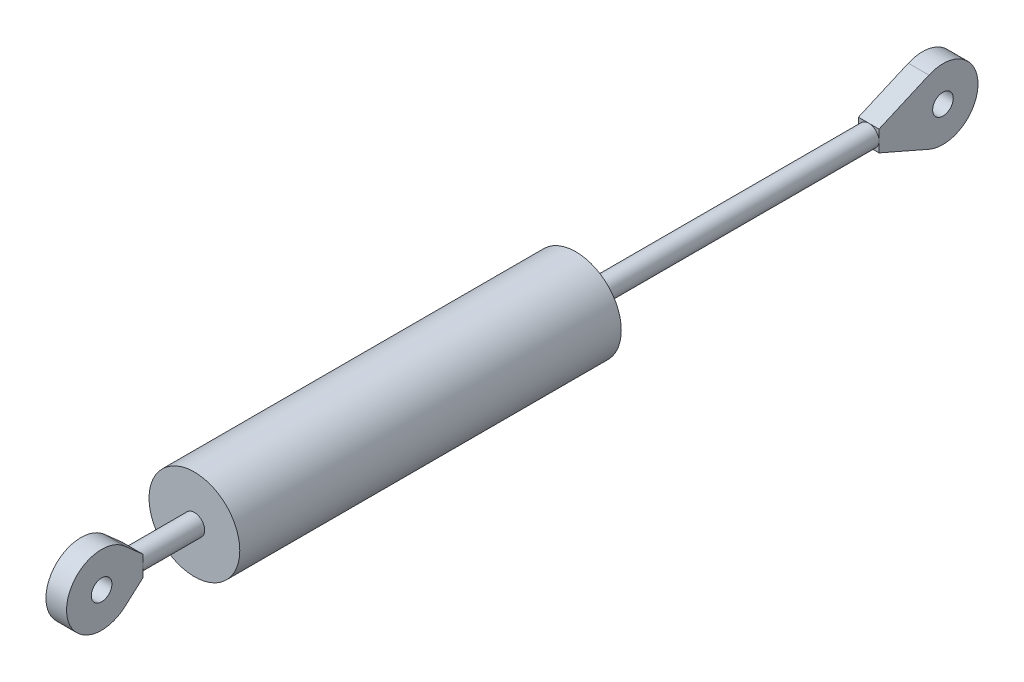
ISO-10303-21;
HEADER;
FILE_DESCRIPTION(('STEP AP214'),'2;1');
FILE_NAME('part.step','',(''),(''),'','','');
FILE_SCHEMA(('AUTOMOTIVE_DESIGN { 1 0 10303 214 1 1 1 1 }'));
ENDSEC;
DATA;
#1=APPLICATION_CONTEXT('core data for automotive mechanical design processes');
#2=APPLICATION_PROTOCOL_DEFINITION('international standard','automotive_design',2000,#1);
#3=PRODUCT_CONTEXT('',#1,'mechanical');
#4=PRODUCT('Part','Part','',(#3));
#5=PRODUCT_RELATED_PRODUCT_CATEGORY('part','',(#4));
#6=PRODUCT_DEFINITION_FORMATION('','',#4);
#7=PRODUCT_DEFINITION_CONTEXT('part definition',#1,'design');
#8=PRODUCT_DEFINITION('design','',#6,#7);
#9=PRODUCT_DEFINITION_SHAPE('','',#8);
#10=(LENGTH_UNIT() NAMED_UNIT(*) SI_UNIT(.MILLI.,.METRE.));
#11=(NAMED_UNIT(*) PLANE_ANGLE_UNIT() SI_UNIT($,.RADIAN.));
#12=(NAMED_UNIT(*) SI_UNIT($,.STERADIAN.) SOLID_ANGLE_UNIT());
#13=UNCERTAINTY_MEASURE_WITH_UNIT(LENGTH_MEASURE(1.E-05),#10,'distance_accuracy_value','');
#14=(GEOMETRIC_REPRESENTATION_CONTEXT(3) GLOBAL_UNCERTAINTY_ASSIGNED_CONTEXT((#13)) GLOBAL_UNIT_ASSIGNED_CONTEXT((#10,
#11,#12)) REPRESENTATION_CONTEXT('',''));
#15=CARTESIAN_POINT('',(0.,0.,0.));
#16=DIRECTION('',(0.,0.,1.));
#17=DIRECTION('',(1.,0.,0.));
#18=AXIS2_PLACEMENT_3D('',#15,#16,#17);
#19=CARTESIAN_POINT('',(0.,11.,46.25));
#20=DIRECTION('',(0.,0.,-1.));
#21=DIRECTION('',(-1.,0.,0.));
#22=AXIS2_PLACEMENT_3D('',#19,#20,#21);
#23=PLANE('',#22);
#24=CARTESIAN_POINT('',(0.,0.,46.25));
#25=DIRECTION('',(0.,0.,1.));
#26=DIRECTION('',(1.,0.,0.));
#27=AXIS2_PLACEMENT_3D('',#24,#25,#26);
#28=CIRCLE('',#27,2.5);
#29=CARTESIAN_POINT('',(2.5,0.,46.25));
#30=VERTEX_POINT('',#29);
#31=EDGE_CURVE('E41',#30,#30,#28,.T.);
#32=ORIENTED_EDGE('',*,*,#31,.F.);
#33=EDGE_LOOP('',(#32));
#34=FACE_BOUND('',#33,.T.);
#35=CARTESIAN_POINT('',(0.,0.,46.25));
#36=DIRECTION('',(0.,0.,1.));
#37=DIRECTION('',(1.,0.,0.));
#38=AXIS2_PLACEMENT_3D('',#35,#36,#37);
#39=CIRCLE('',#38,11.);
#40=CARTESIAN_POINT('',(11.,0.,46.25));
#41=VERTEX_POINT('',#40);
#42=EDGE_CURVE('E228',#41,#41,#39,.T.);
#43=ORIENTED_EDGE('',*,*,#42,.T.);
#44=EDGE_LOOP('',(#43));
#45=FACE_BOUND('',#44,.T.);
#46=ADVANCED_FACE('F33',(#34,#45),#23,.F.);
#47=CARTESIAN_POINT('',(0.,11.,-46.25));
#48=DIRECTION('',(0.,0.,1.));
#49=DIRECTION('',(1.,0.,0.));
#50=AXIS2_PLACEMENT_3D('',#47,#48,#49);
#51=PLANE('',#50);
#52=CARTESIAN_POINT('',(0.,0.,-46.25));
#53=DIRECTION('',(0.,0.,-1.));
#54=DIRECTION('',(-1.,0.,0.));
#55=AXIS2_PLACEMENT_3D('',#52,#53,#54);
#56=CIRCLE('',#55,2.5);
#57=CARTESIAN_POINT('',(-2.5,0.,-46.25));
#58=VERTEX_POINT('',#57);
#59=EDGE_CURVE('E11',#58,#58,#56,.T.);
#60=ORIENTED_EDGE('',*,*,#59,.F.);
#61=EDGE_LOOP('',(#60));
#62=FACE_BOUND('',#61,.T.);
#63=CARTESIAN_POINT('',(0.,0.,-46.25));
#64=DIRECTION('',(0.,0.,1.));
#65=DIRECTION('',(1.,0.,0.));
#66=AXIS2_PLACEMENT_3D('',#63,#64,#65);
#67=CIRCLE('',#66,11.);
#68=CARTESIAN_POINT('',(11.,0.,-46.25));
#69=VERTEX_POINT('',#68);
#70=EDGE_CURVE('E36',#69,#69,#67,.T.);
#71=ORIENTED_EDGE('',*,*,#70,.F.);
#72=EDGE_LOOP('',(#71));
#73=FACE_BOUND('',#72,.T.);
#74=ADVANCED_FACE('F239',(#62,#73),#51,.F.);
#75=CARTESIAN_POINT('',(0.,0.,46.25));
#76=DIRECTION('',(0.,0.,1.));
#77=DIRECTION('',(1.,0.,0.));
#78=AXIS2_PLACEMENT_3D('',#75,#76,#77);
#79=CYLINDRICAL_SURFACE('',#78,11.);
#80=ORIENTED_EDGE('',*,*,#42,.F.);
#81=EDGE_LOOP('',(#80));
#82=FACE_BOUND('',#81,.T.);
#83=ORIENTED_EDGE('',*,*,#70,.T.);
#84=EDGE_LOOP('',(#83));
#85=FACE_BOUND('',#84,.T.);
#86=ADVANCED_FACE('F237',(#82,#85),#79,.T.);
#87=CARTESIAN_POINT('',(0.,0.,61.25));
#88=DIRECTION('',(0.,0.,-1.));
#89=DIRECTION('',(-1.,0.,0.));
#90=AXIS2_PLACEMENT_3D('',#87,#88,#89);
#91=CYLINDRICAL_SURFACE('',#90,2.5);
#92=CARTESIAN_POINT('',(0.,0.,61.25));
#93=DIRECTION('',(0.,0.,1.));
#94=DIRECTION('',(1.,0.,0.));
#95=AXIS2_PLACEMENT_3D('',#92,#93,#94);
#96=CIRCLE('',#95,2.5);
#97=CARTESIAN_POINT('',(2.5,0.,61.25));
#98=VERTEX_POINT('',#97);
#99=CARTESIAN_POINT('',(0.,2.5,61.25));
#100=VERTEX_POINT('',#99);
#101=EDGE_CURVE('E225',#98,#100,#96,.T.);
#102=ORIENTED_EDGE('',*,*,#101,.F.);
#103=CARTESIAN_POINT('',(0.,-2.5,61.25));
#104=VERTEX_POINT('',#103);
#105=EDGE_CURVE('E216',#104,#98,#96,.T.);
#106=ORIENTED_EDGE('',*,*,#105,.F.);
#107=CARTESIAN_POINT('',(-2.5,0.,61.25));
#108=VERTEX_POINT('',#107);
#109=EDGE_CURVE('E483',#108,#104,#96,.T.);
#110=ORIENTED_EDGE('',*,*,#109,.F.);
#111=EDGE_CURVE('E229',#100,#108,#96,.T.);
#112=ORIENTED_EDGE('',*,*,#111,.F.);
#113=EDGE_LOOP('',(#102,#106,#110,#112));
#114=FACE_BOUND('',#113,.T.);
#115=ORIENTED_EDGE('',*,*,#31,.T.);
#116=EDGE_LOOP('',(#115));
#117=FACE_BOUND('',#116,.T.);
#118=ADVANCED_FACE('F246',(#114,#117),#91,.T.);
#119=CARTESIAN_POINT('',(-2.5,2.5,61.25));
#120=DIRECTION('',(0.,0.,-1.));
#121=DIRECTION('',(-1.,0.,0.));
#122=AXIS2_PLACEMENT_3D('',#119,#120,#121);
#123=PLANE('',#122);
#124=DIRECTION('',(0.,1.,0.));
#125=VECTOR('',#124,1.);
#126=CARTESIAN_POINT('',(2.5,2.5,61.25));
#127=LINE('',#126,#125);
#128=CARTESIAN_POINT('',(2.5,2.5,61.25));
#129=VERTEX_POINT('',#128);
#130=EDGE_CURVE('E183',#98,#129,#127,.T.);
#131=ORIENTED_EDGE('',*,*,#130,.F.);
#132=ORIENTED_EDGE('',*,*,#101,.T.);
#133=DIRECTION('',(1.,0.,0.));
#134=VECTOR('',#133,1.);
#135=CARTESIAN_POINT('',(-2.5,2.5,61.25));
#136=LINE('',#135,#134);
#137=EDGE_CURVE('E212',#100,#129,#136,.T.);
#138=ORIENTED_EDGE('',*,*,#137,.T.);
#139=EDGE_LOOP('',(#131,#132,#138));
#140=FACE_BOUND('',#139,.T.);
#141=ADVANCED_FACE('F254',(#140),#123,.T.);
#142=CARTESIAN_POINT('',(-2.5,2.5,61.25));
#143=VERTEX_POINT('',#142);
#144=EDGE_CURVE('E222',#143,#100,#136,.T.);
#145=ORIENTED_EDGE('',*,*,#144,.T.);
#146=ORIENTED_EDGE('',*,*,#111,.T.);
#147=DIRECTION('',(0.,1.,0.));
#148=VECTOR('',#147,1.);
#149=CARTESIAN_POINT('',(-2.5,2.5,61.25));
#150=LINE('',#149,#148);
#151=EDGE_CURVE('E199',#108,#143,#150,.T.);
#152=ORIENTED_EDGE('',*,*,#151,.T.);
#153=EDGE_LOOP('',(#145,#146,#152));
#154=FACE_BOUND('',#153,.T.);
#155=ADVANCED_FACE('F394',(#154),#123,.T.);
#156=CARTESIAN_POINT('',(-2.5,-2.5,61.25));
#157=VERTEX_POINT('',#156);
#158=EDGE_CURVE('E200',#157,#108,#150,.T.);
#159=ORIENTED_EDGE('',*,*,#158,.T.);
#160=ORIENTED_EDGE('',*,*,#109,.T.);
#161=DIRECTION('',(1.,0.,0.));
#162=VECTOR('',#161,1.);
#163=CARTESIAN_POINT('',(-2.5,-2.5,61.25));
#164=LINE('',#163,#162);
#165=EDGE_CURVE('E213',#157,#104,#164,.T.);
#166=ORIENTED_EDGE('',*,*,#165,.F.);
#167=EDGE_LOOP('',(#159,#160,#166));
#168=FACE_BOUND('',#167,.T.);
#169=ADVANCED_FACE('F260',(#168),#123,.T.);
#170=CARTESIAN_POINT('',(2.5,-2.5,61.25));
#171=VERTEX_POINT('',#170);
#172=EDGE_CURVE('E217',#104,#171,#164,.T.);
#173=ORIENTED_EDGE('',*,*,#172,.F.);
#174=ORIENTED_EDGE('',*,*,#105,.T.);
#175=EDGE_CURVE('E184',#171,#98,#127,.T.);
#176=ORIENTED_EDGE('',*,*,#175,.F.);
#177=EDGE_LOOP('',(#173,#174,#176));
#178=FACE_BOUND('',#177,.T.);
#179=ADVANCED_FACE('F256',(#178),#123,.T.);
#180=CARTESIAN_POINT('',(-2.5,-2.5,61.25));
#181=DIRECTION('',(0.,-0.748795472454104,-0.662801131888167));
#182=DIRECTION('',(0.,0.662801131888167,-0.748795472454104));
#183=AXIS2_PLACEMENT_3D('',#180,#181,#182);
#184=PLANE('',#183);
#185=ORIENTED_EDGE('',*,*,#165,.T.);
#186=ORIENTED_EDGE('',*,*,#172,.T.);
#187=DIRECTION('',(0.,0.662801131888167,-0.748795472454104));
#188=VECTOR('',#187,1.);
#189=CARTESIAN_POINT('',(2.5,-2.5,61.25));
#190=LINE('',#189,#188);
#191=CARTESIAN_POINT('',(2.5,-6.3647615158825,65.6161903789506));
#192=VERTEX_POINT('',#191);
#193=EDGE_CURVE('E193',#192,#171,#190,.T.);
#194=ORIENTED_EDGE('',*,*,#193,.F.);
#195=DIRECTION('',(1.,0.,0.));
#196=VECTOR('',#195,1.);
#197=CARTESIAN_POINT('',(-2.5,-6.3647615158825,65.6161903789506));
#198=LINE('',#197,#196);
#199=CARTESIAN_POINT('',(-2.5,-6.3647615158825,65.6161903789506));
#200=VERTEX_POINT('',#199);
#201=EDGE_CURVE('E218',#200,#192,#198,.T.);
#202=ORIENTED_EDGE('',*,*,#201,.F.);
#203=DIRECTION('',(0.,0.662801131888167,-0.748795472454104));
#204=VECTOR('',#203,1.);
#205=CARTESIAN_POINT('',(-2.5,-2.5,61.25));
#206=LINE('',#205,#204);
#207=EDGE_CURVE('E209',#200,#157,#206,.T.);
#208=ORIENTED_EDGE('',*,*,#207,.T.);
#209=EDGE_LOOP('',(#185,#186,#194,#202,#208));
#210=FACE_BOUND('',#209,.T.);
#211=ADVANCED_FACE('F259',(#210),#184,.T.);
#212=CARTESIAN_POINT('',(-2.5,-2.26303351058554E-11,71.25));
#213=DIRECTION('',(1.,0.,0.));
#214=DIRECTION('',(0.,0.,-1.));
#215=AXIS2_PLACEMENT_3D('',#212,#213,#214);
#216=CYLINDRICAL_SURFACE('',#215,8.49999999999999);
#217=ORIENTED_EDGE('',*,*,#201,.T.);
#218=CARTESIAN_POINT('',(2.5,-2.26303351058554E-11,71.25));
#219=DIRECTION('',(1.,0.,0.));
#220=DIRECTION('',(0.,0.,-1.));
#221=AXIS2_PLACEMENT_3D('',#218,#219,#220);
#222=CIRCLE('',#221,8.49999999999999);
#223=CARTESIAN_POINT('',(2.5,6.36476151586999,65.6161903789876));
#224=VERTEX_POINT('',#223);
#225=EDGE_CURVE('E190',#224,#192,#222,.T.);
#226=ORIENTED_EDGE('',*,*,#225,.F.);
#227=DIRECTION('',(1.,0.,0.));
#228=VECTOR('',#227,1.);
#229=CARTESIAN_POINT('',(-2.5,6.36476151586999,65.6161903789876));
#230=LINE('',#229,#228);
#231=CARTESIAN_POINT('',(-2.5,6.36476151586999,65.6161903789876));
#232=VERTEX_POINT('',#231);
#233=EDGE_CURVE('E220',#232,#224,#230,.T.);
#234=ORIENTED_EDGE('',*,*,#233,.F.);
#235=CARTESIAN_POINT('',(-2.5,-2.26303351058554E-11,71.25));
#236=DIRECTION('',(1.,0.,0.));
#237=DIRECTION('',(0.,0.,-1.));
#238=AXIS2_PLACEMENT_3D('',#235,#236,#237);
#239=CIRCLE('',#238,8.49999999999999);
#240=EDGE_CURVE('E206',#232,#200,#239,.T.);
#241=ORIENTED_EDGE('',*,*,#240,.T.);
#242=EDGE_LOOP('',(#217,#226,#234,#241));
#243=FACE_BOUND('',#242,.T.);
#244=ADVANCED_FACE('F266',(#243),#216,.T.);
#245=CARTESIAN_POINT('',(-2.5,2.5,61.25));
#246=DIRECTION('',(0.,0.748795472457955,-0.662801131883816));
#247=DIRECTION('',(0.,0.662801131883816,0.748795472457955));
#248=AXIS2_PLACEMENT_3D('',#245,#246,#247);
#249=PLANE('',#248);
#250=ORIENTED_EDGE('',*,*,#233,.T.);
#251=DIRECTION('',(0.,0.662801131883816,0.748795472457955));
#252=VECTOR('',#251,1.);
#253=CARTESIAN_POINT('',(2.5,2.5,61.25));
#254=LINE('',#253,#252);
#255=EDGE_CURVE('E187',#129,#224,#254,.T.);
#256=ORIENTED_EDGE('',*,*,#255,.F.);
#257=ORIENTED_EDGE('',*,*,#137,.F.);
#258=ORIENTED_EDGE('',*,*,#144,.F.);
#259=DIRECTION('',(0.,0.662801131883816,0.748795472457955));
#260=VECTOR('',#259,1.);
#261=CARTESIAN_POINT('',(-2.5,2.5,61.25));
#262=LINE('',#261,#260);
#263=EDGE_CURVE('E203',#143,#232,#262,.T.);
#264=ORIENTED_EDGE('',*,*,#263,.T.);
#265=EDGE_LOOP('',(#250,#256,#257,#258,#264));
#266=FACE_BOUND('',#265,.T.);
#267=ADVANCED_FACE('F262',(#266),#249,.T.);
#268=CARTESIAN_POINT('',(-2.5,-2.26303351058554E-11,71.25));
#269=DIRECTION('',(1.,0.,0.));
#270=DIRECTION('',(0.,0.,-1.));
#271=AXIS2_PLACEMENT_3D('',#268,#269,#270);
#272=PLANE('',#271);
#273=CARTESIAN_POINT('',(-2.5,-2.26303351058554E-11,71.25));
#274=DIRECTION('',(1.,0.,0.));
#275=DIRECTION('',(0.,0.,-1.));
#276=AXIS2_PLACEMENT_3D('',#273,#274,#275);
#277=CIRCLE('',#276,2.5);
#278=CARTESIAN_POINT('',(-2.5,-2.26303351058554E-11,68.75));
#279=VERTEX_POINT('',#278);
#280=EDGE_CURVE('E196',#279,#279,#277,.T.);
#281=ORIENTED_EDGE('',*,*,#280,.T.);
#282=EDGE_LOOP('',(#281));
#283=FACE_BOUND('',#282,.T.);
#284=ORIENTED_EDGE('',*,*,#158,.F.);
#285=ORIENTED_EDGE('',*,*,#207,.F.);
#286=ORIENTED_EDGE('',*,*,#240,.F.);
#287=ORIENTED_EDGE('',*,*,#263,.F.);
#288=ORIENTED_EDGE('',*,*,#151,.F.);
#289=EDGE_LOOP('',(#284,#285,#286,#287,#288));
#290=FACE_BOUND('',#289,.T.);
#291=ADVANCED_FACE('F265',(#283,#290),#272,.F.);
#292=CARTESIAN_POINT('',(-2.5,-2.26303351058554E-11,71.25));
#293=DIRECTION('',(1.,0.,0.));
#294=DIRECTION('',(0.,0.,-1.));
#295=AXIS2_PLACEMENT_3D('',#292,#293,#294);
#296=CYLINDRICAL_SURFACE('',#295,2.5);
#297=ORIENTED_EDGE('',*,*,#280,.F.);
#298=EDGE_LOOP('',(#297));
#299=FACE_BOUND('',#298,.T.);
#300=CARTESIAN_POINT('',(2.5,-2.26303351058554E-11,71.25));
#301=DIRECTION('',(1.,0.,0.));
#302=DIRECTION('',(0.,0.,-1.));
#303=AXIS2_PLACEMENT_3D('',#300,#301,#302);
#304=CIRCLE('',#303,2.5);
#305=CARTESIAN_POINT('',(2.5,-2.26303351058554E-11,68.75));
#306=VERTEX_POINT('',#305);
#307=EDGE_CURVE('E178',#306,#306,#304,.T.);
#308=ORIENTED_EDGE('',*,*,#307,.T.);
#309=EDGE_LOOP('',(#308));
#310=FACE_BOUND('',#309,.T.);
#311=ADVANCED_FACE('F276',(#299,#310),#296,.F.);
#312=CARTESIAN_POINT('',(2.5,-2.26303351058554E-11,71.25));
#313=DIRECTION('',(1.,0.,0.));
#314=DIRECTION('',(0.,0.,-1.));
#315=AXIS2_PLACEMENT_3D('',#312,#313,#314);
#316=PLANE('',#315);
#317=ORIENTED_EDGE('',*,*,#175,.T.);
#318=ORIENTED_EDGE('',*,*,#130,.T.);
#319=ORIENTED_EDGE('',*,*,#255,.T.);
#320=ORIENTED_EDGE('',*,*,#225,.T.);
#321=ORIENTED_EDGE('',*,*,#193,.T.);
#322=EDGE_LOOP('',(#317,#318,#319,#320,#321));
#323=FACE_BOUND('',#322,.T.);
#324=ORIENTED_EDGE('',*,*,#307,.F.);
#325=EDGE_LOOP('',(#324));
#326=FACE_BOUND('',#325,.T.);
#327=ADVANCED_FACE('F280',(#323,#326),#316,.T.);
#328=CARTESIAN_POINT('',(0.,0.,-117.25));
#329=DIRECTION('',(0.,0.,1.));
#330=DIRECTION('',(1.,0.,0.));
#331=AXIS2_PLACEMENT_3D('',#328,#329,#330);
#332=CYLINDRICAL_SURFACE('',#331,2.5);
#333=CARTESIAN_POINT('',(0.,0.,-117.25));
#334=DIRECTION('',(0.,0.,-1.));
#335=DIRECTION('',(-1.,0.,0.));
#336=AXIS2_PLACEMENT_3D('',#333,#334,#335);
#337=CIRCLE('',#336,2.5);
#338=CARTESIAN_POINT('',(-2.5,0.,-117.25));
#339=VERTEX_POINT('',#338);
#340=CARTESIAN_POINT('',(0.,2.5,-117.25));
#341=VERTEX_POINT('',#340);
#342=EDGE_CURVE('E176',#339,#341,#337,.T.);
#343=ORIENTED_EDGE('',*,*,#342,.F.);
#344=CARTESIAN_POINT('',(0.,-2.5,-117.25));
#345=VERTEX_POINT('',#344);
#346=EDGE_CURVE('E49',#345,#339,#337,.T.);
#347=ORIENTED_EDGE('',*,*,#346,.F.);
#348=CARTESIAN_POINT('',(2.5,0.,-117.25));
#349=VERTEX_POINT('',#348);
#350=EDGE_CURVE('E53',#349,#345,#337,.T.);
#351=ORIENTED_EDGE('',*,*,#350,.F.);
#352=EDGE_CURVE('E179',#341,#349,#337,.T.);
#353=ORIENTED_EDGE('',*,*,#352,.F.);
#354=EDGE_LOOP('',(#343,#347,#351,#353));
#355=FACE_BOUND('',#354,.T.);
#356=ORIENTED_EDGE('',*,*,#59,.T.);
#357=EDGE_LOOP('',(#356));
#358=FACE_BOUND('',#357,.T.);
#359=ADVANCED_FACE('F284',(#355,#358),#332,.T.);
#360=CARTESIAN_POINT('',(-2.5,2.5,-117.25));
#361=DIRECTION('',(0.,0.,1.));
#362=DIRECTION('',(1.,0.,0.));
#363=AXIS2_PLACEMENT_3D('',#360,#361,#362);
#364=PLANE('',#363);
#365=DIRECTION('',(0.,-1.,0.));
#366=VECTOR('',#365,1.);
#367=CARTESIAN_POINT('',(-2.5,2.5,-117.25));
#368=LINE('',#367,#366);
#369=CARTESIAN_POINT('',(-2.5,2.5,-117.25));
#370=VERTEX_POINT('',#369);
#371=EDGE_CURVE('E159',#370,#339,#368,.T.);
#372=ORIENTED_EDGE('',*,*,#371,.T.);
#373=ORIENTED_EDGE('',*,*,#342,.T.);
#374=DIRECTION('',(1.,0.,0.));
#375=VECTOR('',#374,1.);
#376=CARTESIAN_POINT('',(-2.5,2.5,-117.25));
#377=LINE('',#376,#375);
#378=EDGE_CURVE('E169',#370,#341,#377,.T.);
#379=ORIENTED_EDGE('',*,*,#378,.F.);
#380=EDGE_LOOP('',(#372,#373,#379));
#381=FACE_BOUND('',#380,.T.);
#382=ADVANCED_FACE('F288',(#381),#364,.T.);
#383=CARTESIAN_POINT('',(2.5,2.5,-117.25));
#384=VERTEX_POINT('',#383);
#385=EDGE_CURVE('E172',#341,#384,#377,.T.);
#386=ORIENTED_EDGE('',*,*,#385,.F.);
#387=ORIENTED_EDGE('',*,*,#352,.T.);
#388=DIRECTION('',(0.,-1.,0.));
#389=VECTOR('',#388,1.);
#390=CARTESIAN_POINT('',(2.5,2.5,-117.25));
#391=LINE('',#390,#389);
#392=EDGE_CURVE('E132',#384,#349,#391,.T.);
#393=ORIENTED_EDGE('',*,*,#392,.F.);
#394=EDGE_LOOP('',(#386,#387,#393));
#395=FACE_BOUND('',#394,.T.);
#396=ADVANCED_FACE('F344',(#395),#364,.T.);
#397=CARTESIAN_POINT('',(2.5,-2.5,-117.25));
#398=VERTEX_POINT('',#397);
#399=EDGE_CURVE('E122',#349,#398,#391,.T.);
#400=ORIENTED_EDGE('',*,*,#399,.F.);
#401=ORIENTED_EDGE('',*,*,#350,.T.);
#402=DIRECTION('',(1.,0.,0.));
#403=VECTOR('',#402,1.);
#404=CARTESIAN_POINT('',(-2.5,-2.5,-117.25));
#405=LINE('',#404,#403);
#406=EDGE_CURVE('E137',#345,#398,#405,.T.);
#407=ORIENTED_EDGE('',*,*,#406,.T.);
#408=EDGE_LOOP('',(#400,#401,#407));
#409=FACE_BOUND('',#408,.T.);
#410=ADVANCED_FACE('F138',(#409),#364,.T.);
#411=CARTESIAN_POINT('',(-2.5,-2.5,-117.25));
#412=VERTEX_POINT('',#411);
#413=EDGE_CURVE('E142',#412,#345,#405,.T.);
#414=ORIENTED_EDGE('',*,*,#413,.T.);
#415=ORIENTED_EDGE('',*,*,#346,.T.);
#416=EDGE_CURVE('E158',#339,#412,#368,.T.);
#417=ORIENTED_EDGE('',*,*,#416,.T.);
#418=EDGE_LOOP('',(#414,#415,#417));
#419=FACE_BOUND('',#418,.T.);
#420=ADVANCED_FACE('F289',(#419),#364,.T.);
#421=CARTESIAN_POINT('',(-2.5,2.5,-117.25));
#422=DIRECTION('',(0.,0.916250998490399,0.400604677662839));
#423=DIRECTION('',(0.,-0.400604677662839,0.916250998490399));
#424=AXIS2_PLACEMENT_3D('',#421,#422,#423);
#425=PLANE('',#424);
#426=ORIENTED_EDGE('',*,*,#378,.T.);
#427=ORIENTED_EDGE('',*,*,#385,.T.);
#428=DIRECTION('',(0.,-0.400604677662839,0.916250998490399));
#429=VECTOR('',#428,1.);
#430=CARTESIAN_POINT('',(2.5,2.5,-117.25));
#431=LINE('',#430,#429);
#432=CARTESIAN_POINT('',(2.5,7.78813348716839,-129.344860239866));
#433=VERTEX_POINT('',#432);
#434=EDGE_CURVE('E150',#433,#384,#431,.T.);
#435=ORIENTED_EDGE('',*,*,#434,.F.);
#436=DIRECTION('',(1.,0.,0.));
#437=VECTOR('',#436,1.);
#438=CARTESIAN_POINT('',(-2.5,7.78813348716839,-129.344860239866));
#439=LINE('',#438,#437);
#440=CARTESIAN_POINT('',(-2.5,7.78813348716839,-129.344860239866));
#441=VERTEX_POINT('',#440);
#442=EDGE_CURVE('E173',#441,#433,#439,.T.);
#443=ORIENTED_EDGE('',*,*,#442,.F.);
#444=DIRECTION('',(0.,-0.400604677662839,0.916250998490399));
#445=VECTOR('',#444,1.);
#446=CARTESIAN_POINT('',(-2.5,2.5,-117.25));
#447=LINE('',#446,#445);
#448=EDGE_CURVE('E143',#441,#370,#447,.T.);
#449=ORIENTED_EDGE('',*,*,#448,.T.);
#450=EDGE_LOOP('',(#426,#427,#435,#443,#449));
#451=FACE_BOUND('',#450,.T.);
#452=ADVANCED_FACE('F292',(#451),#425,.T.);
#453=CARTESIAN_POINT('',(-2.5,0.,-132.75));
#454=DIRECTION('',(1.,0.,0.));
#455=DIRECTION('',(0.,0.,-1.));
#456=AXIS2_PLACEMENT_3D('',#453,#454,#455);
#457=CYLINDRICAL_SURFACE('',#456,8.5);
#458=ORIENTED_EDGE('',*,*,#442,.T.);
#459=CARTESIAN_POINT('',(2.5,0.,-132.75));
#460=DIRECTION('',(1.,0.,0.));
#461=DIRECTION('',(0.,0.,-1.));
#462=AXIS2_PLACEMENT_3D('',#459,#460,#461);
#463=CIRCLE('',#462,8.5);
#464=CARTESIAN_POINT('',(2.5,-7.78813348716839,-129.344860239866));
#465=VERTEX_POINT('',#464);
#466=EDGE_CURVE('E148',#465,#433,#463,.T.);
#467=ORIENTED_EDGE('',*,*,#466,.F.);
#468=DIRECTION('',(1.,0.,0.));
#469=VECTOR('',#468,1.);
#470=CARTESIAN_POINT('',(-2.5,-7.78813348716839,-129.344860239866));
#471=LINE('',#470,#469);
#472=CARTESIAN_POINT('',(-2.5,-7.78813348716839,-129.344860239866));
#473=VERTEX_POINT('',#472);
#474=EDGE_CURVE('E147',#473,#465,#471,.T.);
#475=ORIENTED_EDGE('',*,*,#474,.F.);
#476=CARTESIAN_POINT('',(-2.5,0.,-132.75));
#477=DIRECTION('',(1.,0.,0.));
#478=DIRECTION('',(0.,0.,-1.));
#479=AXIS2_PLACEMENT_3D('',#476,#477,#478);
#480=CIRCLE('',#479,8.5);
#481=EDGE_CURVE('E164',#473,#441,#480,.T.);
#482=ORIENTED_EDGE('',*,*,#481,.T.);
#483=EDGE_LOOP('',(#458,#467,#475,#482));
#484=FACE_BOUND('',#483,.T.);
#485=ADVANCED_FACE('F297',(#484),#457,.T.);
#486=CARTESIAN_POINT('',(-2.5,-2.5,-117.25));
#487=DIRECTION('',(0.,-0.916250998490399,0.400604677662839));
#488=DIRECTION('',(0.,-0.400604677662839,-0.916250998490399));
#489=AXIS2_PLACEMENT_3D('',#486,#487,#488);
#490=PLANE('',#489);
#491=ORIENTED_EDGE('',*,*,#474,.T.);
#492=DIRECTION('',(0.,-0.400604677662839,-0.916250998490399));
#493=VECTOR('',#492,1.);
#494=CARTESIAN_POINT('',(2.5,-2.5,-117.25));
#495=LINE('',#494,#493);
#496=EDGE_CURVE('E128',#398,#465,#495,.T.);
#497=ORIENTED_EDGE('',*,*,#496,.F.);
#498=ORIENTED_EDGE('',*,*,#406,.F.);
#499=ORIENTED_EDGE('',*,*,#413,.F.);
#500=DIRECTION('',(0.,-0.400604677662839,-0.916250998490399));
#501=VECTOR('',#500,1.);
#502=CARTESIAN_POINT('',(-2.5,-2.5,-117.25));
#503=LINE('',#502,#501);
#504=EDGE_CURVE('E162',#412,#473,#503,.T.);
#505=ORIENTED_EDGE('',*,*,#504,.T.);
#506=EDGE_LOOP('',(#491,#497,#498,#499,#505));
#507=FACE_BOUND('',#506,.T.);
#508=ADVANCED_FACE('F145',(#507),#490,.T.);
#509=CARTESIAN_POINT('',(-2.5,0.,-132.75));
#510=DIRECTION('',(1.,0.,0.));
#511=DIRECTION('',(0.,0.,-1.));
#512=AXIS2_PLACEMENT_3D('',#509,#510,#511);
#513=PLANE('',#512);
#514=CARTESIAN_POINT('',(-2.5,0.,-132.75));
#515=DIRECTION('',(1.,0.,0.));
#516=DIRECTION('',(0.,0.,-1.));
#517=AXIS2_PLACEMENT_3D('',#514,#515,#516);
#518=CIRCLE('',#517,2.5);
#519=CARTESIAN_POINT('',(-2.5,0.,-135.25));
#520=VERTEX_POINT('',#519);
#521=EDGE_CURVE('E155',#520,#520,#518,.T.);
#522=ORIENTED_EDGE('',*,*,#521,.T.);
#523=EDGE_LOOP('',(#522));
#524=FACE_BOUND('',#523,.T.);
#525=ORIENTED_EDGE('',*,*,#371,.F.);
#526=ORIENTED_EDGE('',*,*,#448,.F.);
#527=ORIENTED_EDGE('',*,*,#481,.F.);
#528=ORIENTED_EDGE('',*,*,#504,.F.);
#529=ORIENTED_EDGE('',*,*,#416,.F.);
#530=EDGE_LOOP('',(#525,#526,#527,#528,#529));
#531=FACE_BOUND('',#530,.T.);
#532=ADVANCED_FACE('F296',(#524,#531),#513,.F.);
#533=CARTESIAN_POINT('',(-2.5,0.,-132.75));
#534=DIRECTION('',(1.,0.,0.));
#535=DIRECTION('',(0.,0.,-1.));
#536=AXIS2_PLACEMENT_3D('',#533,#534,#535);
#537=CYLINDRICAL_SURFACE('',#536,2.5);
#538=ORIENTED_EDGE('',*,*,#521,.F.);
#539=EDGE_LOOP('',(#538));
#540=FACE_BOUND('',#539,.T.);
#541=CARTESIAN_POINT('',(2.5,0.,-132.75));
#542=DIRECTION('',(1.,0.,0.));
#543=DIRECTION('',(0.,0.,-1.));
#544=AXIS2_PLACEMENT_3D('',#541,#542,#543);
#545=CIRCLE('',#544,2.5);
#546=CARTESIAN_POINT('',(2.5,0.,-135.25));
#547=VERTEX_POINT('',#546);
#548=EDGE_CURVE('E134',#547,#547,#545,.T.);
#549=ORIENTED_EDGE('',*,*,#548,.T.);
#550=EDGE_LOOP('',(#549));
#551=FACE_BOUND('',#550,.T.);
#552=ADVANCED_FACE('F306',(#540,#551),#537,.F.);
#553=CARTESIAN_POINT('',(2.5,0.,-132.75));
#554=DIRECTION('',(1.,0.,0.));
#555=DIRECTION('',(0.,0.,-1.));
#556=AXIS2_PLACEMENT_3D('',#553,#554,#555);
#557=PLANE('',#556);
#558=ORIENTED_EDGE('',*,*,#392,.T.);
#559=ORIENTED_EDGE('',*,*,#399,.T.);
#560=ORIENTED_EDGE('',*,*,#496,.T.);
#561=ORIENTED_EDGE('',*,*,#466,.T.);
#562=ORIENTED_EDGE('',*,*,#434,.T.);
#563=EDGE_LOOP('',(#558,#559,#560,#561,#562));
#564=FACE_BOUND('',#563,.T.);
#565=ORIENTED_EDGE('',*,*,#548,.F.);
#566=EDGE_LOOP('',(#565));
#567=FACE_BOUND('',#566,.T.);
#568=ADVANCED_FACE('F124',(#564,#567),#557,.T.);
#569=CLOSED_SHELL('',(#46,#74,#86,#118,#141,#155,#169,#179,#211,#244,#267,#291,#311,#327,#359,
#382,#396,#410,#420,#452,#485,#508,#532,#552,#568));
#570=MANIFOLD_SOLID_BREP('B2',#569);
#571=ADVANCED_BREP_SHAPE_REPRESENTATION('',(#18,#570),#14);
#572=SHAPE_DEFINITION_REPRESENTATION(#9,#571);
ENDSEC;
END-ISO-10303-21;
